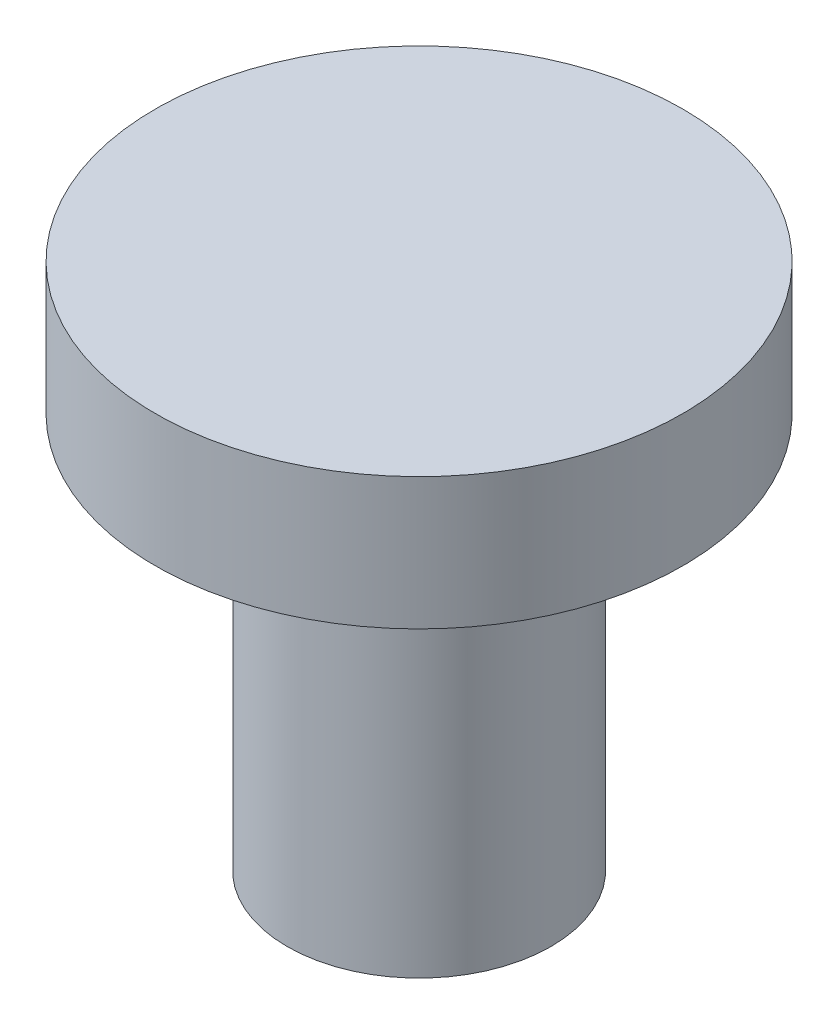
ISO-10303-21;
HEADER;
FILE_DESCRIPTION(('STEP AP214'),'2;1');
FILE_NAME('part.step','',(''),(''),'','','');
FILE_SCHEMA(('AUTOMOTIVE_DESIGN { 1 0 10303 214 1 1 1 1 }'));
ENDSEC;
DATA;
#1=APPLICATION_CONTEXT('core data for automotive mechanical design processes');
#2=APPLICATION_PROTOCOL_DEFINITION('international standard','automotive_design',2000,#1);
#3=PRODUCT_CONTEXT('',#1,'mechanical');
#4=PRODUCT('Part','Part','',(#3));
#5=PRODUCT_RELATED_PRODUCT_CATEGORY('part','',(#4));
#6=PRODUCT_DEFINITION_FORMATION('','',#4);
#7=PRODUCT_DEFINITION_CONTEXT('part definition',#1,'design');
#8=PRODUCT_DEFINITION('design','',#6,#7);
#9=PRODUCT_DEFINITION_SHAPE('','',#8);
#10=(LENGTH_UNIT() NAMED_UNIT(*) SI_UNIT(.MILLI.,.METRE.));
#11=(NAMED_UNIT(*) PLANE_ANGLE_UNIT() SI_UNIT($,.RADIAN.));
#12=(NAMED_UNIT(*) SI_UNIT($,.STERADIAN.) SOLID_ANGLE_UNIT());
#13=UNCERTAINTY_MEASURE_WITH_UNIT(LENGTH_MEASURE(1.E-05),#10,'distance_accuracy_value','');
#14=(GEOMETRIC_REPRESENTATION_CONTEXT(3) GLOBAL_UNCERTAINTY_ASSIGNED_CONTEXT((#13)) GLOBAL_UNIT_ASSIGNED_CONTEXT((#10,
#11,#12)) REPRESENTATION_CONTEXT('',''));
#15=CARTESIAN_POINT('',(0.,0.,0.));
#16=DIRECTION('',(0.,0.,1.));
#17=DIRECTION('',(1.,0.,0.));
#18=AXIS2_PLACEMENT_3D('',#15,#16,#17);
#19=CARTESIAN_POINT('',(0.,4.,0.));
#20=DIRECTION('',(0.,-1.,0.));
#21=DIRECTION('',(0.,0.,-1.));
#22=AXIS2_PLACEMENT_3D('',#19,#20,#21);
#23=CYLINDRICAL_SURFACE('',#22,2.);
#24=CARTESIAN_POINT('',(0.,4.,0.));
#25=DIRECTION('',(0.,-1.,0.));
#26=DIRECTION('',(0.,0.,-1.));
#27=AXIS2_PLACEMENT_3D('',#24,#25,#26);
#28=CIRCLE('',#27,2.);
#29=CARTESIAN_POINT('',(0.,4.,-2.));
#30=VERTEX_POINT('',#29);
#31=EDGE_CURVE('E10',#30,#30,#28,.T.);
#32=ORIENTED_EDGE('',*,*,#31,.T.);
#33=EDGE_LOOP('',(#32));
#34=FACE_BOUND('',#33,.T.);
#35=CARTESIAN_POINT('',(0.,3.,0.));
#36=DIRECTION('',(0.,-1.,0.));
#37=DIRECTION('',(0.,0.,-1.));
#38=AXIS2_PLACEMENT_3D('',#35,#36,#37);
#39=CIRCLE('',#38,2.);
#40=CARTESIAN_POINT('',(0.,3.,-2.));
#41=VERTEX_POINT('',#40);
#42=EDGE_CURVE('E45',#41,#41,#39,.T.);
#43=ORIENTED_EDGE('',*,*,#42,.F.);
#44=EDGE_LOOP('',(#43));
#45=FACE_BOUND('',#44,.T.);
#46=ADVANCED_FACE('F31',(#34,#45),#23,.T.);
#47=CARTESIAN_POINT('',(2.,4.,0.));
#48=DIRECTION('',(0.,1.,0.));
#49=DIRECTION('',(0.,0.,1.));
#50=AXIS2_PLACEMENT_3D('',#47,#48,#49);
#51=PLANE('',#50);
#52=ORIENTED_EDGE('',*,*,#31,.F.);
#53=EDGE_LOOP('',(#52));
#54=FACE_BOUND('',#53,.T.);
#55=ADVANCED_FACE('F55',(#54),#51,.T.);
#56=CARTESIAN_POINT('',(0.,0.,0.));
#57=DIRECTION('',(0.,-1.,0.));
#58=DIRECTION('',(0.,0.,-1.));
#59=AXIS2_PLACEMENT_3D('',#56,#57,#58);
#60=PLANE('',#59);
#61=CARTESIAN_POINT('',(0.,0.,0.));
#62=DIRECTION('',(0.,-1.,0.));
#63=DIRECTION('',(0.,0.,-1.));
#64=AXIS2_PLACEMENT_3D('',#61,#62,#63);
#65=CIRCLE('',#64,1.);
#66=CARTESIAN_POINT('',(0.,0.,-1.));
#67=VERTEX_POINT('',#66);
#68=EDGE_CURVE('E37',#67,#67,#65,.T.);
#69=ORIENTED_EDGE('',*,*,#68,.T.);
#70=EDGE_LOOP('',(#69));
#71=FACE_BOUND('',#70,.T.);
#72=ADVANCED_FACE('F59',(#71),#60,.T.);
#73=CARTESIAN_POINT('',(0.,4.,0.));
#74=DIRECTION('',(0.,-1.,0.));
#75=DIRECTION('',(0.,0.,-1.));
#76=AXIS2_PLACEMENT_3D('',#73,#74,#75);
#77=CYLINDRICAL_SURFACE('',#76,1.);
#78=CARTESIAN_POINT('',(0.,3.,0.));
#79=DIRECTION('',(0.,-1.,0.));
#80=DIRECTION('',(0.,0.,-1.));
#81=AXIS2_PLACEMENT_3D('',#78,#79,#80);
#82=CIRCLE('',#81,1.);
#83=CARTESIAN_POINT('',(0.,3.,-1.));
#84=VERTEX_POINT('',#83);
#85=EDGE_CURVE('E41',#84,#84,#82,.T.);
#86=ORIENTED_EDGE('',*,*,#85,.T.);
#87=EDGE_LOOP('',(#86));
#88=FACE_BOUND('',#87,.T.);
#89=ORIENTED_EDGE('',*,*,#68,.F.);
#90=EDGE_LOOP('',(#89));
#91=FACE_BOUND('',#90,.T.);
#92=ADVANCED_FACE('F64',(#88,#91),#77,.T.);
#93=CARTESIAN_POINT('',(1.,3.,0.));
#94=DIRECTION('',(0.,-1.,0.));
#95=DIRECTION('',(0.,0.,-1.));
#96=AXIS2_PLACEMENT_3D('',#93,#94,#95);
#97=PLANE('',#96);
#98=ORIENTED_EDGE('',*,*,#42,.T.);
#99=EDGE_LOOP('',(#98));
#100=FACE_BOUND('',#99,.T.);
#101=ORIENTED_EDGE('',*,*,#85,.F.);
#102=EDGE_LOOP('',(#101));
#103=FACE_BOUND('',#102,.T.);
#104=ADVANCED_FACE('F51',(#100,#103),#97,.T.);
#105=CLOSED_SHELL('',(#46,#55,#72,#92,#104));
#106=MANIFOLD_SOLID_BREP('B2',#105);
#107=ADVANCED_BREP_SHAPE_REPRESENTATION('',(#18,#106),#14);
#108=SHAPE_DEFINITION_REPRESENTATION(#9,#107);
ENDSEC;
END-ISO-10303-21;
